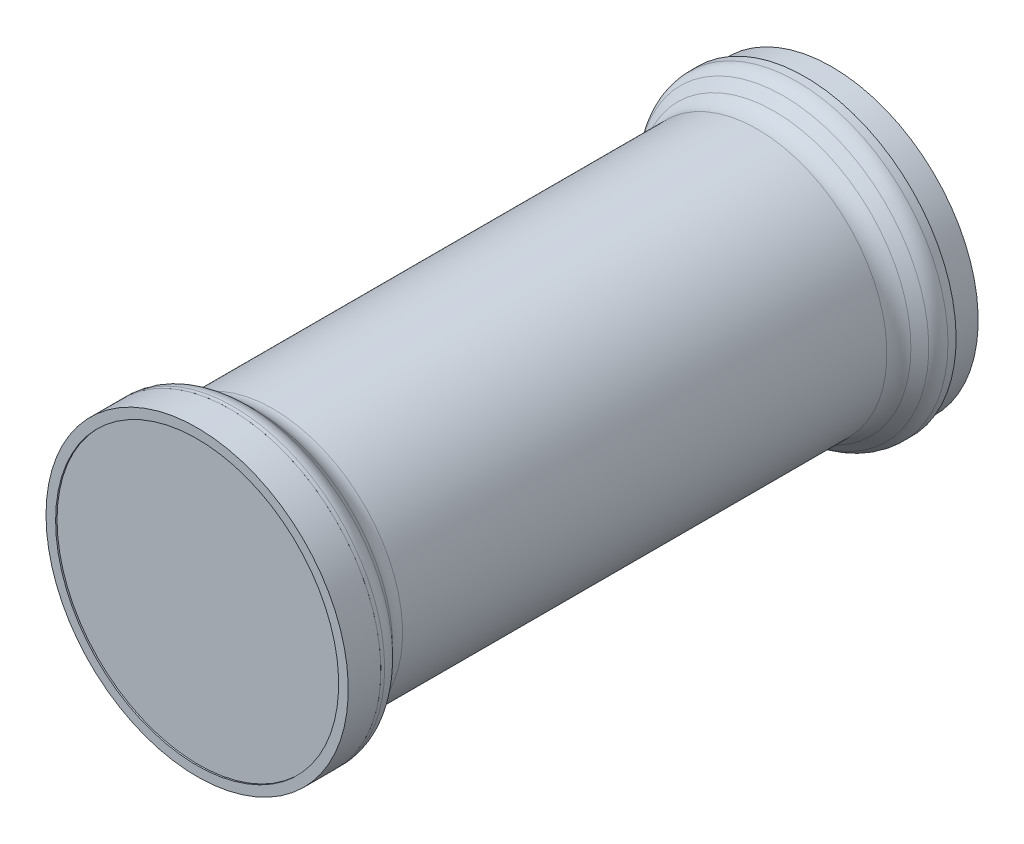
ISO-10303-21;
HEADER;
FILE_DESCRIPTION(('STEP AP214'),'2;1');
FILE_NAME('part.step','',(''),(''),'','','');
FILE_SCHEMA(('AUTOMOTIVE_DESIGN { 1 0 10303 214 1 1 1 1 }'));
ENDSEC;
DATA;
#1=APPLICATION_CONTEXT('core data for automotive mechanical design processes');
#2=APPLICATION_PROTOCOL_DEFINITION('international standard','automotive_design',2000,#1);
#3=PRODUCT_CONTEXT('',#1,'mechanical');
#4=PRODUCT('Part','Part','',(#3));
#5=PRODUCT_RELATED_PRODUCT_CATEGORY('part','',(#4));
#6=PRODUCT_DEFINITION_FORMATION('','',#4);
#7=PRODUCT_DEFINITION_CONTEXT('part definition',#1,'design');
#8=PRODUCT_DEFINITION('design','',#6,#7);
#9=PRODUCT_DEFINITION_SHAPE('','',#8);
#10=(LENGTH_UNIT() NAMED_UNIT(*) SI_UNIT(.MILLI.,.METRE.));
#11=(NAMED_UNIT(*) PLANE_ANGLE_UNIT() SI_UNIT($,.RADIAN.));
#12=(NAMED_UNIT(*) SI_UNIT($,.STERADIAN.) SOLID_ANGLE_UNIT());
#13=UNCERTAINTY_MEASURE_WITH_UNIT(LENGTH_MEASURE(1.E-05),#10,'distance_accuracy_value','');
#14=(GEOMETRIC_REPRESENTATION_CONTEXT(3) GLOBAL_UNCERTAINTY_ASSIGNED_CONTEXT((#13)) GLOBAL_UNIT_ASSIGNED_CONTEXT((#10,
#11,#12)) REPRESENTATION_CONTEXT('',''));
#15=CARTESIAN_POINT('',(0.,0.,0.));
#16=DIRECTION('',(0.,0.,1.));
#17=DIRECTION('',(1.,0.,0.));
#18=AXIS2_PLACEMENT_3D('',#15,#16,#17);
#19=CARTESIAN_POINT('',(0.,0.,66.3));
#20=DIRECTION('',(0.,0.,-1.));
#21=DIRECTION('',(-1.,0.,0.));
#22=AXIS2_PLACEMENT_3D('',#19,#20,#21);
#23=CYLINDRICAL_SURFACE('',#22,29.5000000000001);
#24=CARTESIAN_POINT('',(0.,0.,66.3));
#25=DIRECTION('',(0.,0.,-1.));
#26=DIRECTION('',(-1.,0.,0.));
#27=AXIS2_PLACEMENT_3D('',#24,#25,#26);
#28=CIRCLE('',#27,29.5000000000001);
#29=CARTESIAN_POINT('',(-29.5000000000002,0.,66.3));
#30=VERTEX_POINT('',#29);
#31=EDGE_CURVE('P0_E18',#30,#30,#28,.T.);
#32=ORIENTED_EDGE('',*,*,#31,.F.);
#33=EDGE_LOOP('',(#32));
#34=FACE_BOUND('',#33,.T.);
#35=CARTESIAN_POINT('',(0.,0.,59.5));
#36=DIRECTION('',(0.,0.,-1.));
#37=DIRECTION('',(-1.,0.,0.));
#38=AXIS2_PLACEMENT_3D('',#35,#36,#37);
#39=CIRCLE('',#38,29.5000000000001);
#40=CARTESIAN_POINT('',(-29.5000000000002,0.,59.5));
#41=VERTEX_POINT('',#40);
#42=EDGE_CURVE('P0_E27',#41,#41,#39,.T.);
#43=ORIENTED_EDGE('',*,*,#42,.T.);
#44=EDGE_LOOP('',(#43));
#45=FACE_BOUND('',#44,.T.);
#46=ADVANCED_FACE('P0_F15',(#34,#45),#23,.F.);
#47=CARTESIAN_POINT('',(0.,0.,66.3));
#48=DIRECTION('',(0.,0.,1.));
#49=DIRECTION('',(1.,0.,0.));
#50=AXIS2_PLACEMENT_3D('',#47,#48,#49);
#51=PLANE('',#50);
#52=CARTESIAN_POINT('',(0.,0.,66.3));
#53=DIRECTION('',(0.,0.,-1.));
#54=DIRECTION('',(-1.,0.,0.));
#55=AXIS2_PLACEMENT_3D('',#52,#53,#54);
#56=CIRCLE('',#55,31.5000000000001);
#57=CARTESIAN_POINT('',(-31.5000000000002,0.,66.3));
#58=VERTEX_POINT('',#57);
#59=EDGE_CURVE('P0_E22',#58,#58,#56,.T.);
#60=ORIENTED_EDGE('',*,*,#59,.F.);
#61=EDGE_LOOP('',(#60));
#62=FACE_BOUND('',#61,.T.);
#63=ORIENTED_EDGE('',*,*,#31,.T.);
#64=EDGE_LOOP('',(#63));
#65=FACE_BOUND('',#64,.T.);
#66=ADVANCED_FACE('P0_F35',(#62,#65),#51,.T.);
#67=CARTESIAN_POINT('',(0.,0.,59.5));
#68=DIRECTION('',(0.,0.,1.));
#69=DIRECTION('',(1.,0.,0.));
#70=AXIS2_PLACEMENT_3D('',#67,#68,#69);
#71=PLANE('',#70);
#72=CARTESIAN_POINT('',(0.,0.,59.5));
#73=DIRECTION('',(0.,0.,-1.));
#74=DIRECTION('',(-1.,0.,0.));
#75=AXIS2_PLACEMENT_3D('',#72,#73,#74);
#76=CIRCLE('',#75,31.5000000000001);
#77=CARTESIAN_POINT('',(-31.5000000000002,0.,59.5));
#78=VERTEX_POINT('',#77);
#79=EDGE_CURVE('P0_E10',#78,#78,#76,.F.);
#80=ORIENTED_EDGE('',*,*,#79,.F.);
#81=EDGE_LOOP('',(#80));
#82=FACE_BOUND('',#81,.T.);
#83=ORIENTED_EDGE('',*,*,#42,.F.);
#84=EDGE_LOOP('',(#83));
#85=FACE_BOUND('',#84,.T.);
#86=ADVANCED_FACE('P0_F42',(#82,#85),#71,.F.);
#87=CARTESIAN_POINT('',(0.,0.,66.3));
#88=DIRECTION('',(0.,0.,-1.));
#89=DIRECTION('',(-1.,0.,0.));
#90=AXIS2_PLACEMENT_3D('',#87,#88,#89);
#91=CYLINDRICAL_SURFACE('',#90,31.5000000000001);
#92=ORIENTED_EDGE('',*,*,#79,.T.);
#93=EDGE_LOOP('',(#92));
#94=FACE_BOUND('',#93,.T.);
#95=ORIENTED_EDGE('',*,*,#59,.T.);
#96=EDGE_LOOP('',(#95));
#97=FACE_BOUND('',#96,.T.);
#98=ADVANCED_FACE('P0_F44',(#94,#97),#91,.T.);
#99=CLOSED_SHELL('',(#46,#66,#86,#98));
#100=MANIFOLD_SOLID_BREP('P0_B1',#99);
#101=CARTESIAN_POINT('',(0.,25.4,66.));
#102=DIRECTION('',(0.,0.,-1.));
#103=DIRECTION('',(0.,1.,0.));
#104=AXIS2_PLACEMENT_3D('',#101,#102,#103);
#105=PLANE('',#104);
#106=CARTESIAN_POINT('',(0.,0.,65.9999999999999));
#107=DIRECTION('',(0.,0.,1.));
#108=DIRECTION('',(0.,-1.,0.));
#109=AXIS2_PLACEMENT_3D('',#106,#107,#108);
#110=CIRCLE('',#109,30.5);
#111=CARTESIAN_POINT('',(0.,-30.5,65.9999999999999));
#112=VERTEX_POINT('',#111);
#113=EDGE_CURVE('P1_E19',#112,#112,#110,.F.);
#114=ORIENTED_EDGE('',*,*,#113,.F.);
#115=EDGE_LOOP('',(#114));
#116=FACE_BOUND('',#115,.T.);
#117=ADVANCED_FACE('P1_F15',(#116),#105,.F.);
#118=CARTESIAN_POINT('',(0.,25.4,-66.));
#119=DIRECTION('',(0.,0.,1.));
#120=DIRECTION('',(0.,-1.,0.));
#121=AXIS2_PLACEMENT_3D('',#118,#119,#120);
#122=PLANE('',#121);
#123=CARTESIAN_POINT('',(0.,0.,-65.9999999999996));
#124=DIRECTION('',(0.,0.,-1.));
#125=DIRECTION('',(0.,1.,0.));
#126=AXIS2_PLACEMENT_3D('',#123,#124,#125);
#127=CIRCLE('',#126,30.5000000000001);
#128=CARTESIAN_POINT('',(0.,30.5,-65.9999999999996));
#129=VERTEX_POINT('',#128);
#130=EDGE_CURVE('P1_E55',#129,#129,#127,.F.);
#131=ORIENTED_EDGE('',*,*,#130,.F.);
#132=EDGE_LOOP('',(#131));
#133=FACE_BOUND('',#132,.T.);
#134=ADVANCED_FACE('P1_F74',(#133),#122,.F.);
#135=CARTESIAN_POINT('',(0.,0.,66.));
#136=DIRECTION('',(0.,0.,1.));
#137=DIRECTION('',(0.,-1.,0.));
#138=AXIS2_PLACEMENT_3D('',#135,#136,#137);
#139=CYLINDRICAL_SURFACE('',#138,30.5);
#140=CARTESIAN_POINT('',(0.,0.,59.7));
#141=DIRECTION('',(0.,0.,1.));
#142=DIRECTION('',(0.,1.,0.));
#143=AXIS2_PLACEMENT_3D('',#140,#141,#142);
#144=CIRCLE('',#143,30.5);
#145=CARTESIAN_POINT('',(0.,30.5,59.7));
#146=VERTEX_POINT('',#145);
#147=EDGE_CURVE('P1_E51',#146,#146,#144,.T.);
#148=ORIENTED_EDGE('',*,*,#147,.T.);
#149=EDGE_LOOP('',(#148));
#150=FACE_BOUND('',#149,.T.);
#151=ORIENTED_EDGE('',*,*,#113,.T.);
#152=EDGE_LOOP('',(#151));
#153=FACE_BOUND('',#152,.T.);
#154=ADVANCED_FACE('P1_F71',(#150,#153),#139,.T.);
#155=CARTESIAN_POINT('',(0.,0.,-65.9999999999997));
#156=DIRECTION('',(0.,0.,-1.));
#157=DIRECTION('',(0.,1.,0.));
#158=AXIS2_PLACEMENT_3D('',#155,#156,#157);
#159=CYLINDRICAL_SURFACE('',#158,30.5000000000001);
#160=ORIENTED_EDGE('',*,*,#130,.T.);
#161=EDGE_LOOP('',(#160));
#162=FACE_BOUND('',#161,.T.);
#163=CARTESIAN_POINT('',(0.,0.,-60.4));
#164=DIRECTION('',(0.,0.,-1.));
#165=DIRECTION('',(0.,1.,0.));
#166=AXIS2_PLACEMENT_3D('',#163,#164,#165);
#167=CIRCLE('',#166,30.5000000000001);
#168=CARTESIAN_POINT('',(0.,30.5,-60.4000000000001));
#169=VERTEX_POINT('',#168);
#170=EDGE_CURVE('P1_E54',#169,#169,#167,.T.);
#171=ORIENTED_EDGE('',*,*,#170,.T.);
#172=EDGE_LOOP('',(#171));
#173=FACE_BOUND('',#172,.T.);
#174=ADVANCED_FACE('P1_F120',(#162,#173),#159,.T.);
#175=CARTESIAN_POINT('',(0.,0.,59.7));
#176=DIRECTION('',(0.,0.,1.));
#177=DIRECTION('',(0.,-1.,0.));
#178=AXIS2_PLACEMENT_3D('',#175,#176,#177);
#179=TOROIDAL_SURFACE('',#178,30.7,0.199999999999994);
#180=CARTESIAN_POINT('',(0.,0.,59.5));
#181=DIRECTION('',(0.,0.,1.));
#182=DIRECTION('',(0.,-1.,0.));
#183=AXIS2_PLACEMENT_3D('',#180,#181,#182);
#184=CIRCLE('',#183,30.7);
#185=CARTESIAN_POINT('',(0.,-30.7,59.5));
#186=VERTEX_POINT('',#185);
#187=EDGE_CURVE('P1_E61',#186,#186,#184,.T.);
#188=ORIENTED_EDGE('',*,*,#187,.T.);
#189=EDGE_LOOP('',(#188));
#190=FACE_BOUND('',#189,.T.);
#191=ORIENTED_EDGE('',*,*,#147,.F.);
#192=EDGE_LOOP('',(#191));
#193=FACE_BOUND('',#192,.T.);
#194=ADVANCED_FACE('P1_F118',(#190,#193),#179,.F.);
#195=CARTESIAN_POINT('',(0.,29.,-60.4));
#196=DIRECTION('',(0.,0.,1.));
#197=DIRECTION('',(0.,-1.,0.));
#198=AXIS2_PLACEMENT_3D('',#195,#196,#197);
#199=PLANE('',#198);
#200=ORIENTED_EDGE('',*,*,#170,.F.);
#201=EDGE_LOOP('',(#200));
#202=FACE_BOUND('',#201,.T.);
#203=CARTESIAN_POINT('',(0.,0.,-60.4));
#204=DIRECTION('',(0.,0.,1.));
#205=DIRECTION('',(0.,-1.,0.));
#206=AXIS2_PLACEMENT_3D('',#203,#204,#205);
#207=CIRCLE('',#206,31.5);
#208=CARTESIAN_POINT('',(0.,-31.5,-60.4));
#209=VERTEX_POINT('',#208);
#210=EDGE_CURVE('P1_E58',#209,#209,#207,.T.);
#211=ORIENTED_EDGE('',*,*,#210,.F.);
#212=EDGE_LOOP('',(#211));
#213=FACE_BOUND('',#212,.T.);
#214=ADVANCED_FACE('P1_F114',(#202,#213),#199,.F.);
#215=CARTESIAN_POINT('',(0.,30.7,59.5));
#216=DIRECTION('',(0.,0.,-1.));
#217=DIRECTION('',(0.,1.,0.));
#218=AXIS2_PLACEMENT_3D('',#215,#216,#217);
#219=PLANE('',#218);
#220=ORIENTED_EDGE('',*,*,#187,.F.);
#221=EDGE_LOOP('',(#220));
#222=FACE_BOUND('',#221,.T.);
#223=CARTESIAN_POINT('',(0.,0.,59.5));
#224=DIRECTION('',(0.,0.,1.));
#225=DIRECTION('',(0.,-1.,0.));
#226=AXIS2_PLACEMENT_3D('',#223,#224,#225);
#227=CIRCLE('',#226,31.5);
#228=CARTESIAN_POINT('',(0.,-31.5,59.5));
#229=VERTEX_POINT('',#228);
#230=EDGE_CURVE('P1_E46',#229,#229,#227,.F.);
#231=ORIENTED_EDGE('',*,*,#230,.F.);
#232=EDGE_LOOP('',(#231));
#233=FACE_BOUND('',#232,.T.);
#234=ADVANCED_FACE('P1_F110',(#222,#233),#219,.F.);
#235=CARTESIAN_POINT('',(0.,0.,66.));
#236=DIRECTION('',(0.,0.,1.));
#237=DIRECTION('',(0.,-1.,0.));
#238=AXIS2_PLACEMENT_3D('',#235,#236,#237);
#239=CYLINDRICAL_SURFACE('',#238,31.5);
#240=CARTESIAN_POINT('',(0.,0.,-58.7068542494924));
#241=DIRECTION('',(0.,0.,1.));
#242=DIRECTION('',(0.,1.,0.));
#243=AXIS2_PLACEMENT_3D('',#240,#241,#242);
#244=CIRCLE('',#243,31.5);
#245=CARTESIAN_POINT('',(0.,31.5,-58.7068542494924));
#246=VERTEX_POINT('',#245);
#247=EDGE_CURVE('P1_E43',#246,#246,#244,.T.);
#248=ORIENTED_EDGE('',*,*,#247,.F.);
#249=EDGE_LOOP('',(#248));
#250=FACE_BOUND('',#249,.T.);
#251=ORIENTED_EDGE('',*,*,#210,.T.);
#252=EDGE_LOOP('',(#251));
#253=FACE_BOUND('',#252,.T.);
#254=ADVANCED_FACE('P1_F106',(#250,#253),#239,.T.);
#255=CARTESIAN_POINT('',(0.,0.,66.));
#256=DIRECTION('',(0.,0.,1.));
#257=DIRECTION('',(0.,-1.,0.));
#258=AXIS2_PLACEMENT_3D('',#255,#256,#257);
#259=CYLINDRICAL_SURFACE('',#258,31.5);
#260=ORIENTED_EDGE('',*,*,#230,.T.);
#261=EDGE_LOOP('',(#260));
#262=FACE_BOUND('',#261,.T.);
#263=CARTESIAN_POINT('',(0.,0.,58.7068542494924));
#264=DIRECTION('',(0.,0.,-1.));
#265=DIRECTION('',(0.,1.,0.));
#266=AXIS2_PLACEMENT_3D('',#263,#264,#265);
#267=CIRCLE('',#266,31.5);
#268=CARTESIAN_POINT('',(0.,31.5,58.7068542494924));
#269=VERTEX_POINT('',#268);
#270=EDGE_CURVE('P1_E42',#269,#269,#267,.T.);
#271=ORIENTED_EDGE('',*,*,#270,.F.);
#272=EDGE_LOOP('',(#271));
#273=FACE_BOUND('',#272,.T.);
#274=ADVANCED_FACE('P1_F102',(#262,#273),#259,.T.);
#275=CARTESIAN_POINT('',(0.,0.,-58.7068542494924));
#276=DIRECTION('',(0.,0.,-1.));
#277=DIRECTION('',(0.,1.,0.));
#278=AXIS2_PLACEMENT_3D('',#275,#276,#277);
#279=TOROIDAL_SURFACE('',#278,27.5,3.99999999999999);
#280=ORIENTED_EDGE('',*,*,#247,.T.);
#281=EDGE_LOOP('',(#280));
#282=FACE_BOUND('',#281,.T.);
#283=CARTESIAN_POINT('',(0.,0.,-55.8784271247462));
#284=DIRECTION('',(0.,0.,-1.));
#285=DIRECTION('',(0.,1.,0.));
#286=AXIS2_PLACEMENT_3D('',#283,#284,#285);
#287=CIRCLE('',#286,30.3284271247462);
#288=CARTESIAN_POINT('',(0.,30.3284271247462,-55.8784271247462));
#289=VERTEX_POINT('',#288);
#290=EDGE_CURVE('P1_E39',#289,#289,#287,.F.);
#291=ORIENTED_EDGE('',*,*,#290,.F.);
#292=EDGE_LOOP('',(#291));
#293=FACE_BOUND('',#292,.T.);
#294=ADVANCED_FACE('P1_F105',(#282,#293),#279,.T.);
#295=CARTESIAN_POINT('',(0.,0.,58.7068542494924));
#296=DIRECTION('',(0.,0.,-1.));
#297=DIRECTION('',(0.,1.,0.));
#298=AXIS2_PLACEMENT_3D('',#295,#296,#297);
#299=TOROIDAL_SURFACE('',#298,27.5000000000001,3.99999999999994);
#300=CARTESIAN_POINT('',(0.,0.,55.8784271247462));
#301=DIRECTION('',(0.,0.,1.));
#302=DIRECTION('',(0.,-1.,0.));
#303=AXIS2_PLACEMENT_3D('',#300,#301,#302);
#304=CIRCLE('',#303,30.3284271247462);
#305=CARTESIAN_POINT('',(0.,-30.3284271247462,55.8784271247462));
#306=VERTEX_POINT('',#305);
#307=EDGE_CURVE('P1_E36',#306,#306,#304,.F.);
#308=ORIENTED_EDGE('',*,*,#307,.F.);
#309=EDGE_LOOP('',(#308));
#310=FACE_BOUND('',#309,.T.);
#311=ORIENTED_EDGE('',*,*,#270,.T.);
#312=EDGE_LOOP('',(#311));
#313=FACE_BOUND('',#312,.T.);
#314=ADVANCED_FACE('P1_F100',(#310,#313),#299,.T.);
#315=CARTESIAN_POINT('',(0.,0.,-55.8784271247462));
#316=DIRECTION('',(0.,0.,-1.));
#317=DIRECTION('',(-1.,0.,0.));
#318=AXIS2_PLACEMENT_3D('',#315,#316,#317);
#319=CONICAL_SURFACE('',#318,30.3284271247462,0.785398163397449);
#320=ORIENTED_EDGE('',*,*,#290,.T.);
#321=EDGE_LOOP('',(#320));
#322=FACE_BOUND('',#321,.T.);
#323=CARTESIAN_POINT('',(0.,0.,-54.0144660940673));
#324=DIRECTION('',(0.,0.,-1.));
#325=DIRECTION('',(0.,-1.,0.));
#326=AXIS2_PLACEMENT_3D('',#323,#324,#325);
#327=CIRCLE('',#326,28.4644660940673);
#328=CARTESIAN_POINT('',(0.,-28.4644660940672,-54.0144660940673));
#329=VERTEX_POINT('',#328);
#330=EDGE_CURVE('P1_E33',#329,#329,#327,.T.);
#331=ORIENTED_EDGE('',*,*,#330,.T.);
#332=EDGE_LOOP('',(#331));
#333=FACE_BOUND('',#332,.T.);
#334=ADVANCED_FACE('P1_F96',(#322,#333),#319,.T.);
#335=CARTESIAN_POINT('',(0.,0.,55.8784271247462));
#336=DIRECTION('',(0.,0.,1.));
#337=DIRECTION('',(1.,0.,0.));
#338=AXIS2_PLACEMENT_3D('',#335,#336,#337);
#339=CONICAL_SURFACE('',#338,30.3284271247462,0.785398163397449);
#340=ORIENTED_EDGE('',*,*,#307,.T.);
#341=EDGE_LOOP('',(#340));
#342=FACE_BOUND('',#341,.T.);
#343=CARTESIAN_POINT('',(0.,0.,54.0144660940673));
#344=DIRECTION('',(0.,0.,1.));
#345=DIRECTION('',(0.,-1.,0.));
#346=AXIS2_PLACEMENT_3D('',#343,#344,#345);
#347=CIRCLE('',#346,28.4644660940672);
#348=CARTESIAN_POINT('',(0.,-28.4644660940672,54.0144660940673));
#349=VERTEX_POINT('',#348);
#350=EDGE_CURVE('P1_E28',#349,#349,#347,.T.);
#351=ORIENTED_EDGE('',*,*,#350,.T.);
#352=EDGE_LOOP('',(#351));
#353=FACE_BOUND('',#352,.T.);
#354=ADVANCED_FACE('P1_F93',(#342,#353),#339,.T.);
#355=CARTESIAN_POINT('',(0.,0.,-50.4789321881346));
#356=DIRECTION('',(0.,0.,1.));
#357=DIRECTION('',(1.,0.,0.));
#358=AXIS2_PLACEMENT_3D('',#355,#356,#357);
#359=TOROIDAL_SURFACE('',#358,32.,5.00000000000002);
#360=CARTESIAN_POINT('',(0.,0.,-50.4789321881346));
#361=DIRECTION('',(0.,0.,1.));
#362=DIRECTION('',(0.,-1.,0.));
#363=AXIS2_PLACEMENT_3D('',#360,#361,#362);
#364=CIRCLE('',#363,27.);
#365=CARTESIAN_POINT('',(0.,-27.,-50.4789321881346));
#366=VERTEX_POINT('',#365);
#367=EDGE_CURVE('P1_E23',#366,#366,#364,.T.);
#368=ORIENTED_EDGE('',*,*,#367,.F.);
#369=EDGE_LOOP('',(#368));
#370=FACE_BOUND('',#369,.T.);
#371=ORIENTED_EDGE('',*,*,#330,.F.);
#372=EDGE_LOOP('',(#371));
#373=FACE_BOUND('',#372,.T.);
#374=ADVANCED_FACE('P1_F89',(#370,#373),#359,.F.);
#375=CARTESIAN_POINT('',(0.,0.,50.4789321881346));
#376=DIRECTION('',(0.,0.,1.));
#377=DIRECTION('',(0.,-1.,0.));
#378=AXIS2_PLACEMENT_3D('',#375,#376,#377);
#379=TOROIDAL_SURFACE('',#378,32.,5.00000000000002);
#380=ORIENTED_EDGE('',*,*,#350,.F.);
#381=EDGE_LOOP('',(#380));
#382=FACE_BOUND('',#381,.T.);
#383=CARTESIAN_POINT('',(0.,0.,50.4789321881346));
#384=DIRECTION('',(0.,0.,1.));
#385=DIRECTION('',(0.,-1.,0.));
#386=AXIS2_PLACEMENT_3D('',#383,#384,#385);
#387=CIRCLE('',#386,27.);
#388=CARTESIAN_POINT('',(0.,-27.,50.4789321881345));
#389=VERTEX_POINT('',#388);
#390=EDGE_CURVE('P1_E10',#389,#389,#387,.F.);
#391=ORIENTED_EDGE('',*,*,#390,.F.);
#392=EDGE_LOOP('',(#391));
#393=FACE_BOUND('',#392,.T.);
#394=ADVANCED_FACE('P1_F17',(#382,#393),#379,.F.);
#395=CARTESIAN_POINT('',(0.,0.,66.));
#396=DIRECTION('',(0.,0.,1.));
#397=DIRECTION('',(0.,-1.,0.));
#398=AXIS2_PLACEMENT_3D('',#395,#396,#397);
#399=CYLINDRICAL_SURFACE('',#398,27.);
#400=ORIENTED_EDGE('',*,*,#390,.T.);
#401=EDGE_LOOP('',(#400));
#402=FACE_BOUND('',#401,.T.);
#403=ORIENTED_EDGE('',*,*,#367,.T.);
#404=EDGE_LOOP('',(#403));
#405=FACE_BOUND('',#404,.T.);
#406=ADVANCED_FACE('P1_F83',(#402,#405),#399,.T.);
#407=CLOSED_SHELL('',(#117,#134,#154,#174,#194,#214,#234,#254,#274,#294,#314,#334,#354,#374,
#394,#406));
#408=MANIFOLD_SOLID_BREP('P1_B1',#407);
#409=ADVANCED_BREP_SHAPE_REPRESENTATION('',(#18,#100,#408),#14);
#410=SHAPE_DEFINITION_REPRESENTATION(#9,#409);
ENDSEC;
END-ISO-10303-21;
